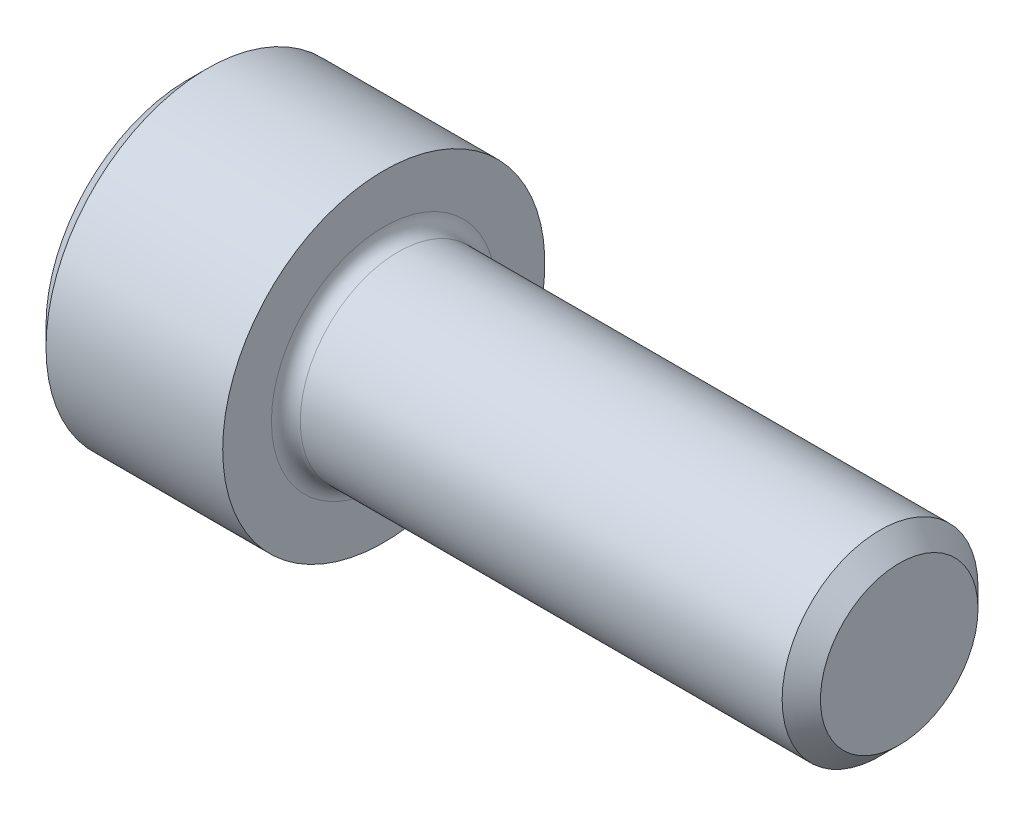
ISO-10303-21;
HEADER;
FILE_DESCRIPTION(('STEP AP214'),'2;1');
FILE_NAME('part.step','',(''),(''),'','','');
FILE_SCHEMA(('AUTOMOTIVE_DESIGN { 1 0 10303 214 1 1 1 1 }'));
ENDSEC;
DATA;
#1=APPLICATION_CONTEXT('core data for automotive mechanical design processes');
#2=APPLICATION_PROTOCOL_DEFINITION('international standard','automotive_design',2000,#1);
#3=PRODUCT_CONTEXT('',#1,'mechanical');
#4=PRODUCT('Part','Part','',(#3));
#5=PRODUCT_RELATED_PRODUCT_CATEGORY('part','',(#4));
#6=PRODUCT_DEFINITION_FORMATION('','',#4);
#7=PRODUCT_DEFINITION_CONTEXT('part definition',#1,'design');
#8=PRODUCT_DEFINITION('design','',#6,#7);
#9=PRODUCT_DEFINITION_SHAPE('','',#8);
#10=(LENGTH_UNIT() NAMED_UNIT(*) SI_UNIT(.MILLI.,.METRE.));
#11=(NAMED_UNIT(*) PLANE_ANGLE_UNIT() SI_UNIT($,.RADIAN.));
#12=(NAMED_UNIT(*) SI_UNIT($,.STERADIAN.) SOLID_ANGLE_UNIT());
#13=UNCERTAINTY_MEASURE_WITH_UNIT(LENGTH_MEASURE(1.E-05),#10,'distance_accuracy_value','');
#14=(GEOMETRIC_REPRESENTATION_CONTEXT(3) GLOBAL_UNCERTAINTY_ASSIGNED_CONTEXT((#13)) GLOBAL_UNIT_ASSIGNED_CONTEXT((#10,
#11,#12)) REPRESENTATION_CONTEXT('',''));
#15=CARTESIAN_POINT('',(0.,0.,0.));
#16=DIRECTION('',(0.,0.,1.));
#17=DIRECTION('',(1.,0.,0.));
#18=AXIS2_PLACEMENT_3D('',#15,#16,#17);
#19=CARTESIAN_POINT('',(2.286,0.,0.));
#20=DIRECTION('',(-1.,0.,0.));
#21=DIRECTION('',(0.,0.,1.));
#22=AXIS2_PLACEMENT_3D('',#19,#20,#21);
#23=PLANE('',#22);
#24=DIRECTION('',(0.,-1.,0.));
#25=VECTOR('',#24,1.);
#26=CARTESIAN_POINT('',(2.286,1.1460460578441,-1.98501));
#27=LINE('',#26,#25);
#28=CARTESIAN_POINT('',(2.286,1.1460460578441,-1.98501));
#29=VERTEX_POINT('',#28);
#30=CARTESIAN_POINT('',(2.286,0.,-1.98501));
#31=VERTEX_POINT('',#30);
#32=EDGE_CURVE('E212',#29,#31,#27,.T.);
#33=ORIENTED_EDGE('',*,*,#32,.T.);
#34=CARTESIAN_POINT('',(2.286,0.,0.));
#35=DIRECTION('',(1.,0.,0.));
#36=DIRECTION('',(0.,0.,-1.));
#37=AXIS2_PLACEMENT_3D('',#34,#35,#36);
#38=CIRCLE('',#37,1.98501);
#39=CARTESIAN_POINT('',(2.286,1.71906908676615,-0.992505000000008));
#40=VERTEX_POINT('',#39);
#41=EDGE_CURVE('E52',#31,#40,#38,.T.);
#42=ORIENTED_EDGE('',*,*,#41,.T.);
#43=DIRECTION('',(0.,-0.500000000000003,-0.866025403784437));
#44=VECTOR('',#43,1.);
#45=CARTESIAN_POINT('',(2.286,2.29209211568821,0.));
#46=LINE('',#45,#44);
#47=EDGE_CURVE('E243',#40,#29,#46,.T.);
#48=ORIENTED_EDGE('',*,*,#47,.T.);
#49=EDGE_LOOP('',(#33,#42,#48));
#50=FACE_BOUND('',#49,.T.);
#51=ADVANCED_FACE('F37',(#50),#23,.T.);
#52=CARTESIAN_POINT('',(2.286,2.29209211568821,0.));
#53=VERTEX_POINT('',#52);
#54=EDGE_CURVE('E240',#53,#40,#46,.T.);
#55=ORIENTED_EDGE('',*,*,#54,.T.);
#56=CARTESIAN_POINT('',(2.286,1.71906908676615,0.992505));
#57=VERTEX_POINT('',#56);
#58=EDGE_CURVE('E203',#40,#57,#38,.T.);
#59=ORIENTED_EDGE('',*,*,#58,.T.);
#60=DIRECTION('',(0.,0.499999999999999,-0.866025403784439));
#61=VECTOR('',#60,1.);
#62=CARTESIAN_POINT('',(2.286,1.14604605784411,1.98501));
#63=LINE('',#62,#61);
#64=EDGE_CURVE('E247',#57,#53,#63,.T.);
#65=ORIENTED_EDGE('',*,*,#64,.T.);
#66=EDGE_LOOP('',(#55,#59,#65));
#67=FACE_BOUND('',#66,.T.);
#68=ADVANCED_FACE('F127',(#67),#23,.T.);
#69=CARTESIAN_POINT('',(2.286,1.14604605784411,1.98501));
#70=VERTEX_POINT('',#69);
#71=EDGE_CURVE('E244',#70,#57,#63,.T.);
#72=ORIENTED_EDGE('',*,*,#71,.T.);
#73=CARTESIAN_POINT('',(2.286,0.,1.98501));
#74=VERTEX_POINT('',#73);
#75=EDGE_CURVE('E261',#57,#74,#38,.T.);
#76=ORIENTED_EDGE('',*,*,#75,.T.);
#77=DIRECTION('',(0.,1.,0.));
#78=VECTOR('',#77,1.);
#79=CARTESIAN_POINT('',(2.286,-1.14604605784409,1.98501));
#80=LINE('',#79,#78);
#81=EDGE_CURVE('E251',#74,#70,#80,.T.);
#82=ORIENTED_EDGE('',*,*,#81,.T.);
#83=EDGE_LOOP('',(#72,#76,#82));
#84=FACE_BOUND('',#83,.T.);
#85=ADVANCED_FACE('F132',(#84),#23,.T.);
#86=CARTESIAN_POINT('',(2.286,-1.14604605784409,1.98501));
#87=VERTEX_POINT('',#86);
#88=EDGE_CURVE('E248',#87,#74,#80,.T.);
#89=ORIENTED_EDGE('',*,*,#88,.T.);
#90=CARTESIAN_POINT('',(2.286,-1.71906908676615,0.992505000000006));
#91=VERTEX_POINT('',#90);
#92=EDGE_CURVE('E265',#74,#91,#38,.T.);
#93=ORIENTED_EDGE('',*,*,#92,.T.);
#94=DIRECTION('',(0.,0.500000000000002,0.866025403784438));
#95=VECTOR('',#94,1.);
#96=CARTESIAN_POINT('',(2.286,-2.2920921156882,0.));
#97=LINE('',#96,#95);
#98=EDGE_CURVE('E255',#91,#87,#97,.T.);
#99=ORIENTED_EDGE('',*,*,#98,.T.);
#100=EDGE_LOOP('',(#89,#93,#99));
#101=FACE_BOUND('',#100,.T.);
#102=ADVANCED_FACE('F277',(#101),#23,.T.);
#103=CARTESIAN_POINT('',(2.286,-2.2920921156882,0.));
#104=VERTEX_POINT('',#103);
#105=EDGE_CURVE('E252',#104,#91,#97,.T.);
#106=ORIENTED_EDGE('',*,*,#105,.T.);
#107=CARTESIAN_POINT('',(2.286,-1.71906908676615,-0.992505000000001));
#108=VERTEX_POINT('',#107);
#109=EDGE_CURVE('E262',#91,#108,#38,.T.);
#110=ORIENTED_EDGE('',*,*,#109,.T.);
#111=DIRECTION('',(0.,-0.5,0.866025403784439));
#112=VECTOR('',#111,1.);
#113=CARTESIAN_POINT('',(2.286,-1.1460460578441,-1.98501));
#114=LINE('',#113,#112);
#115=EDGE_CURVE('E224',#108,#104,#114,.T.);
#116=ORIENTED_EDGE('',*,*,#115,.T.);
#117=EDGE_LOOP('',(#106,#110,#116));
#118=FACE_BOUND('',#117,.T.);
#119=ADVANCED_FACE('F125',(#118),#23,.T.);
#120=CARTESIAN_POINT('',(4.826,0.,0.));
#121=DIRECTION('',(-1.,0.,0.));
#122=DIRECTION('',(0.,0.,1.));
#123=AXIS2_PLACEMENT_3D('',#120,#121,#122);
#124=CYLINDRICAL_SURFACE('',#123,3.96875);
#125=CARTESIAN_POINT('',(0.472439999999965,0.,0.));
#126=DIRECTION('',(-1.,0.,0.));
#127=DIRECTION('',(0.,0.,1.));
#128=AXIS2_PLACEMENT_3D('',#125,#126,#127);
#129=CIRCLE('',#128,3.96875);
#130=CARTESIAN_POINT('',(0.472439999999965,0.,3.96875));
#131=VERTEX_POINT('',#130);
#132=EDGE_CURVE('E190',#131,#131,#129,.F.);
#133=ORIENTED_EDGE('',*,*,#132,.T.);
#134=EDGE_LOOP('',(#133));
#135=FACE_BOUND('',#134,.T.);
#136=CARTESIAN_POINT('',(4.826,0.,0.));
#137=DIRECTION('',(-1.,0.,0.));
#138=DIRECTION('',(0.,0.,1.));
#139=AXIS2_PLACEMENT_3D('',#136,#137,#138);
#140=CIRCLE('',#139,3.96875);
#141=CARTESIAN_POINT('',(4.826,0.,3.96875));
#142=VERTEX_POINT('',#141);
#143=EDGE_CURVE('E204',#142,#142,#140,.T.);
#144=ORIENTED_EDGE('',*,*,#143,.T.);
#145=EDGE_LOOP('',(#144));
#146=FACE_BOUND('',#145,.T.);
#147=ADVANCED_FACE('F173',(#135,#146),#124,.T.);
#148=CARTESIAN_POINT('',(4.826,3.96875,0.));
#149=DIRECTION('',(1.,0.,0.));
#150=DIRECTION('',(0.,0.,-1.));
#151=AXIS2_PLACEMENT_3D('',#148,#149,#150);
#152=PLANE('',#151);
#153=CARTESIAN_POINT('',(4.826,0.,0.));
#154=DIRECTION('',(1.,0.,0.));
#155=DIRECTION('',(0.,0.,-1.));
#156=AXIS2_PLACEMENT_3D('',#153,#154,#155);
#157=CIRCLE('',#156,2.7686);
#158=CARTESIAN_POINT('',(4.826,0.,-2.7686));
#159=VERTEX_POINT('',#158);
#160=EDGE_CURVE('E11',#159,#159,#157,.F.);
#161=ORIENTED_EDGE('',*,*,#160,.T.);
#162=EDGE_LOOP('',(#161));
#163=FACE_BOUND('',#162,.T.);
#164=ORIENTED_EDGE('',*,*,#143,.F.);
#165=EDGE_LOOP('',(#164));
#166=FACE_BOUND('',#165,.T.);
#167=ADVANCED_FACE('F169',(#163,#166),#152,.T.);
#168=CARTESIAN_POINT('',(0.,0.,0.));
#169=DIRECTION('',(-1.,0.,0.));
#170=DIRECTION('',(0.,0.,1.));
#171=AXIS2_PLACEMENT_3D('',#168,#169,#170);
#172=PLANE('',#171);
#173=CARTESIAN_POINT('',(0.,0.,0.));
#174=DIRECTION('',(-1.,0.,0.));
#175=DIRECTION('',(0.,0.,1.));
#176=AXIS2_PLACEMENT_3D('',#173,#174,#175);
#177=CIRCLE('',#176,3.49631);
#178=CARTESIAN_POINT('',(0.,0.,3.49631));
#179=VERTEX_POINT('',#178);
#180=EDGE_CURVE('E194',#179,#179,#177,.T.);
#181=ORIENTED_EDGE('',*,*,#180,.T.);
#182=EDGE_LOOP('',(#181));
#183=FACE_BOUND('',#182,.T.);
#184=DIRECTION('',(0.,-0.5,0.866025403784439));
#185=VECTOR('',#184,1.);
#186=CARTESIAN_POINT('',(0.,-1.1460460578441,-1.98501));
#187=LINE('',#186,#185);
#188=CARTESIAN_POINT('',(0.,-1.1460460578441,-1.98501));
#189=VERTEX_POINT('',#188);
#190=CARTESIAN_POINT('',(0.,-2.29209211568819,0.));
#191=VERTEX_POINT('',#190);
#192=EDGE_CURVE('E60',#189,#191,#187,.T.);
#193=ORIENTED_EDGE('',*,*,#192,.F.);
#194=DIRECTION('',(0.,-1.,0.));
#195=VECTOR('',#194,1.);
#196=CARTESIAN_POINT('',(0.,1.1460460578441,-1.98501));
#197=LINE('',#196,#195);
#198=CARTESIAN_POINT('',(0.,1.1460460578441,-1.98501));
#199=VERTEX_POINT('',#198);
#200=EDGE_CURVE('E221',#199,#189,#197,.T.);
#201=ORIENTED_EDGE('',*,*,#200,.F.);
#202=DIRECTION('',(0.,-0.500000000000003,-0.866025403784437));
#203=VECTOR('',#202,1.);
#204=CARTESIAN_POINT('',(0.,2.29209211568821,0.));
#205=LINE('',#204,#203);
#206=CARTESIAN_POINT('',(0.,2.29209211568821,0.));
#207=VERTEX_POINT('',#206);
#208=EDGE_CURVE('E225',#207,#199,#205,.T.);
#209=ORIENTED_EDGE('',*,*,#208,.F.);
#210=DIRECTION('',(0.,0.499999999999999,-0.866025403784439));
#211=VECTOR('',#210,1.);
#212=CARTESIAN_POINT('',(0.,1.14604605784411,1.98501));
#213=LINE('',#212,#211);
#214=CARTESIAN_POINT('',(0.,1.14604605784411,1.98501));
#215=VERTEX_POINT('',#214);
#216=EDGE_CURVE('E228',#215,#207,#213,.T.);
#217=ORIENTED_EDGE('',*,*,#216,.F.);
#218=DIRECTION('',(0.,1.,0.));
#219=VECTOR('',#218,1.);
#220=CARTESIAN_POINT('',(0.,-1.14604605784409,1.98501));
#221=LINE('',#220,#219);
#222=CARTESIAN_POINT('',(0.,-1.14604605784409,1.98501));
#223=VERTEX_POINT('',#222);
#224=EDGE_CURVE('E231',#223,#215,#221,.T.);
#225=ORIENTED_EDGE('',*,*,#224,.F.);
#226=DIRECTION('',(0.,0.500000000000002,0.866025403784438));
#227=VECTOR('',#226,1.);
#228=CARTESIAN_POINT('',(0.,-2.2920921156882,0.));
#229=LINE('',#228,#227);
#230=EDGE_CURVE('E234',#191,#223,#229,.T.);
#231=ORIENTED_EDGE('',*,*,#230,.F.);
#232=EDGE_LOOP('',(#193,#201,#209,#217,#225,#231));
#233=FACE_BOUND('',#232,.T.);
#234=ADVANCED_FACE('F165',(#183,#233),#172,.T.);
#235=CARTESIAN_POINT('',(17.526,0.,0.));
#236=DIRECTION('',(-1.,0.,0.));
#237=DIRECTION('',(0.,0.,1.));
#238=AXIS2_PLACEMENT_3D('',#235,#236,#237);
#239=CYLINDRICAL_SURFACE('',#238,2.413);
#240=CARTESIAN_POINT('',(5.1816,0.,0.));
#241=DIRECTION('',(1.,0.,0.));
#242=DIRECTION('',(0.,0.,-1.));
#243=AXIS2_PLACEMENT_3D('',#240,#241,#242);
#244=CIRCLE('',#243,2.413);
#245=CARTESIAN_POINT('',(5.1816,0.,-2.413));
#246=VERTEX_POINT('',#245);
#247=EDGE_CURVE('E45',#246,#246,#244,.T.);
#248=ORIENTED_EDGE('',*,*,#247,.T.);
#249=EDGE_LOOP('',(#248));
#250=FACE_BOUND('',#249,.T.);
#251=CARTESIAN_POINT('',(17.05356,0.,0.));
#252=DIRECTION('',(1.,0.,0.));
#253=DIRECTION('',(0.,0.,-1.));
#254=AXIS2_PLACEMENT_3D('',#251,#252,#253);
#255=CIRCLE('',#254,2.413);
#256=CARTESIAN_POINT('',(17.05356,0.,-2.413));
#257=VERTEX_POINT('',#256);
#258=EDGE_CURVE('E186',#257,#257,#255,.F.);
#259=ORIENTED_EDGE('',*,*,#258,.T.);
#260=EDGE_LOOP('',(#259));
#261=FACE_BOUND('',#260,.T.);
#262=ADVANCED_FACE('F161',(#250,#261),#239,.T.);
#263=CARTESIAN_POINT('',(17.526,0.,0.));
#264=DIRECTION('',(1.,0.,0.));
#265=DIRECTION('',(0.,0.,-1.));
#266=AXIS2_PLACEMENT_3D('',#263,#264,#265);
#267=PLANE('',#266);
#268=CARTESIAN_POINT('',(17.526,0.,0.));
#269=DIRECTION('',(1.,0.,0.));
#270=DIRECTION('',(0.,0.,-1.));
#271=AXIS2_PLACEMENT_3D('',#268,#269,#270);
#272=CIRCLE('',#271,1.94055999999999);
#273=CARTESIAN_POINT('',(17.526,0.,-1.94055999999999));
#274=VERTEX_POINT('',#273);
#275=EDGE_CURVE('E189',#274,#274,#272,.T.);
#276=ORIENTED_EDGE('',*,*,#275,.T.);
#277=EDGE_LOOP('',(#276));
#278=FACE_BOUND('',#277,.T.);
#279=ADVANCED_FACE('F158',(#278),#267,.T.);
#280=CARTESIAN_POINT('',(2.286,-1.1460460578441,-1.98501));
#281=DIRECTION('',(0.,-0.866025403784439,-0.5));
#282=DIRECTION('',(0.,0.5,-0.866025403784439));
#283=AXIS2_PLACEMENT_3D('',#280,#281,#282);
#284=PLANE('',#283);
#285=ORIENTED_EDGE('',*,*,#192,.T.);
#286=DIRECTION('',(-1.,0.,0.));
#287=VECTOR('',#286,1.);
#288=CARTESIAN_POINT('',(2.286,-2.2920921156882,0.));
#289=LINE('',#288,#287);
#290=EDGE_CURVE('E209',#104,#191,#289,.T.);
#291=ORIENTED_EDGE('',*,*,#290,.F.);
#292=ORIENTED_EDGE('',*,*,#115,.F.);
#293=CARTESIAN_POINT('',(2.286,-1.1460460578441,-1.98501));
#294=VERTEX_POINT('',#293);
#295=EDGE_CURVE('E256',#294,#108,#114,.T.);
#296=ORIENTED_EDGE('',*,*,#295,.F.);
#297=DIRECTION('',(-1.,0.,0.));
#298=VECTOR('',#297,1.);
#299=CARTESIAN_POINT('',(2.286,-1.1460460578441,-1.98501));
#300=LINE('',#299,#298);
#301=EDGE_CURVE('E208',#294,#189,#300,.T.);
#302=ORIENTED_EDGE('',*,*,#301,.T.);
#303=EDGE_LOOP('',(#285,#291,#292,#296,#302));
#304=FACE_BOUND('',#303,.T.);
#305=ADVANCED_FACE('F140',(#304),#284,.F.);
#306=CARTESIAN_POINT('',(2.286,1.1460460578441,-1.98501));
#307=DIRECTION('',(0.,0.,-1.));
#308=DIRECTION('',(-1.,0.,0.));
#309=AXIS2_PLACEMENT_3D('',#306,#307,#308);
#310=PLANE('',#309);
#311=ORIENTED_EDGE('',*,*,#200,.T.);
#312=ORIENTED_EDGE('',*,*,#301,.F.);
#313=EDGE_CURVE('E239',#31,#294,#27,.T.);
#314=ORIENTED_EDGE('',*,*,#313,.F.);
#315=ORIENTED_EDGE('',*,*,#32,.F.);
#316=DIRECTION('',(-1.,0.,0.));
#317=VECTOR('',#316,1.);
#318=CARTESIAN_POINT('',(2.286,1.1460460578441,-1.98501));
#319=LINE('',#318,#317);
#320=EDGE_CURVE('E218',#29,#199,#319,.T.);
#321=ORIENTED_EDGE('',*,*,#320,.T.);
#322=EDGE_LOOP('',(#311,#312,#314,#315,#321));
#323=FACE_BOUND('',#322,.T.);
#324=ADVANCED_FACE('F136',(#323),#310,.F.);
#325=CARTESIAN_POINT('',(2.286,2.29209211568821,0.));
#326=DIRECTION('',(0.,0.866025403784437,-0.500000000000003));
#327=DIRECTION('',(0.,0.500000000000003,0.866025403784437));
#328=AXIS2_PLACEMENT_3D('',#325,#326,#327);
#329=PLANE('',#328);
#330=ORIENTED_EDGE('',*,*,#208,.T.);
#331=ORIENTED_EDGE('',*,*,#320,.F.);
#332=ORIENTED_EDGE('',*,*,#47,.F.);
#333=ORIENTED_EDGE('',*,*,#54,.F.);
#334=DIRECTION('',(-1.,0.,0.));
#335=VECTOR('',#334,1.);
#336=CARTESIAN_POINT('',(2.286,2.29209211568821,0.));
#337=LINE('',#336,#335);
#338=EDGE_CURVE('E216',#53,#207,#337,.T.);
#339=ORIENTED_EDGE('',*,*,#338,.T.);
#340=EDGE_LOOP('',(#330,#331,#332,#333,#339));
#341=FACE_BOUND('',#340,.T.);
#342=ADVANCED_FACE('F139',(#341),#329,.F.);
#343=CARTESIAN_POINT('',(2.286,1.14604605784411,1.98501));
#344=DIRECTION('',(0.,0.866025403784439,0.499999999999999));
#345=DIRECTION('',(0.,-0.499999999999999,0.866025403784439));
#346=AXIS2_PLACEMENT_3D('',#343,#344,#345);
#347=PLANE('',#346);
#348=ORIENTED_EDGE('',*,*,#216,.T.);
#349=ORIENTED_EDGE('',*,*,#338,.F.);
#350=ORIENTED_EDGE('',*,*,#64,.F.);
#351=ORIENTED_EDGE('',*,*,#71,.F.);
#352=DIRECTION('',(-1.,0.,0.));
#353=VECTOR('',#352,1.);
#354=CARTESIAN_POINT('',(2.286,1.14604605784411,1.98501));
#355=LINE('',#354,#353);
#356=EDGE_CURVE('E214',#70,#215,#355,.T.);
#357=ORIENTED_EDGE('',*,*,#356,.T.);
#358=EDGE_LOOP('',(#348,#349,#350,#351,#357));
#359=FACE_BOUND('',#358,.T.);
#360=ADVANCED_FACE('F144',(#359),#347,.F.);
#361=CARTESIAN_POINT('',(2.286,-1.14604605784409,1.98501));
#362=DIRECTION('',(0.,0.,1.));
#363=DIRECTION('',(1.,0.,0.));
#364=AXIS2_PLACEMENT_3D('',#361,#362,#363);
#365=PLANE('',#364);
#366=ORIENTED_EDGE('',*,*,#224,.T.);
#367=ORIENTED_EDGE('',*,*,#356,.F.);
#368=ORIENTED_EDGE('',*,*,#81,.F.);
#369=ORIENTED_EDGE('',*,*,#88,.F.);
#370=DIRECTION('',(-1.,0.,0.));
#371=VECTOR('',#370,1.);
#372=CARTESIAN_POINT('',(2.286,-1.14604605784409,1.98501));
#373=LINE('',#372,#371);
#374=EDGE_CURVE('E211',#87,#223,#373,.T.);
#375=ORIENTED_EDGE('',*,*,#374,.T.);
#376=EDGE_LOOP('',(#366,#367,#368,#369,#375));
#377=FACE_BOUND('',#376,.T.);
#378=ADVANCED_FACE('F148',(#377),#365,.F.);
#379=CARTESIAN_POINT('',(2.286,-2.2920921156882,0.));
#380=DIRECTION('',(0.,-0.866025403784438,0.500000000000002));
#381=DIRECTION('',(0.,-0.500000000000002,-0.866025403784438));
#382=AXIS2_PLACEMENT_3D('',#379,#380,#381);
#383=PLANE('',#382);
#384=ORIENTED_EDGE('',*,*,#230,.T.);
#385=ORIENTED_EDGE('',*,*,#374,.F.);
#386=ORIENTED_EDGE('',*,*,#98,.F.);
#387=ORIENTED_EDGE('',*,*,#105,.F.);
#388=ORIENTED_EDGE('',*,*,#290,.T.);
#389=EDGE_LOOP('',(#384,#385,#386,#387,#388));
#390=FACE_BOUND('',#389,.T.);
#391=ADVANCED_FACE('F122',(#390),#383,.F.);
#392=ORIENTED_EDGE('',*,*,#295,.T.);
#393=EDGE_CURVE('E207',#108,#31,#38,.T.);
#394=ORIENTED_EDGE('',*,*,#393,.T.);
#395=ORIENTED_EDGE('',*,*,#313,.T.);
#396=EDGE_LOOP('',(#392,#394,#395));
#397=FACE_BOUND('',#396,.T.);
#398=ADVANCED_FACE('F113',(#397),#23,.T.);
#399=CARTESIAN_POINT('',(3.4320460578441,0.,0.));
#400=DIRECTION('',(-1.,0.,0.));
#401=DIRECTION('',(0.,0.,1.));
#402=AXIS2_PLACEMENT_3D('',#399,#400,#401);
#403=CONICAL_SURFACE('',#402,0.,1.0471975511966);
#404=ORIENTED_EDGE('',*,*,#41,.F.);
#405=ORIENTED_EDGE('',*,*,#393,.F.);
#406=ORIENTED_EDGE('',*,*,#109,.F.);
#407=ORIENTED_EDGE('',*,*,#92,.F.);
#408=ORIENTED_EDGE('',*,*,#75,.F.);
#409=ORIENTED_EDGE('',*,*,#58,.F.);
#410=EDGE_LOOP('',(#404,#405,#406,#407,#408,#409));
#411=FACE_BOUND('',#410,.T.);
#412=CARTESIAN_POINT('',(3.4320460578441,0.,0.));
#413=VERTEX_POINT('',#412);
#414=VERTEX_LOOP('',#413);
#415=FACE_BOUND('',#414,.T.);
#416=ADVANCED_FACE('F110',(#411,#415),#403,.F.);
#417=CARTESIAN_POINT('',(0.,0.,0.));
#418=DIRECTION('',(1.,0.,0.));
#419=DIRECTION('',(0.,0.,-1.));
#420=AXIS2_PLACEMENT_3D('',#417,#418,#419);
#421=CONICAL_SURFACE('',#420,3.49631,0.785398163397491);
#422=ORIENTED_EDGE('',*,*,#132,.F.);
#423=EDGE_LOOP('',(#422));
#424=FACE_BOUND('',#423,.T.);
#425=ORIENTED_EDGE('',*,*,#180,.F.);
#426=EDGE_LOOP('',(#425));
#427=FACE_BOUND('',#426,.T.);
#428=ADVANCED_FACE('F112',(#424,#427),#421,.T.);
#429=CARTESIAN_POINT('',(17.526,0.,0.));
#430=DIRECTION('',(-1.,0.,0.));
#431=DIRECTION('',(0.,0.,1.));
#432=AXIS2_PLACEMENT_3D('',#429,#430,#431);
#433=CONICAL_SURFACE('',#432,1.94055999999999,0.785398163397494);
#434=ORIENTED_EDGE('',*,*,#258,.F.);
#435=EDGE_LOOP('',(#434));
#436=FACE_BOUND('',#435,.T.);
#437=ORIENTED_EDGE('',*,*,#275,.F.);
#438=EDGE_LOOP('',(#437));
#439=FACE_BOUND('',#438,.T.);
#440=ADVANCED_FACE('F119',(#436,#439),#433,.T.);
#441=CARTESIAN_POINT('',(5.1816,0.,0.));
#442=DIRECTION('',(1.,0.,0.));
#443=DIRECTION('',(0.,0.,-1.));
#444=AXIS2_PLACEMENT_3D('',#441,#442,#443);
#445=TOROIDAL_SURFACE('',#444,2.7686,0.3556);
#446=ORIENTED_EDGE('',*,*,#160,.F.);
#447=EDGE_LOOP('',(#446));
#448=FACE_BOUND('',#447,.T.);
#449=ORIENTED_EDGE('',*,*,#247,.F.);
#450=EDGE_LOOP('',(#449));
#451=FACE_BOUND('',#450,.T.);
#452=ADVANCED_FACE('F39',(#448,#451),#445,.F.);
#453=CLOSED_SHELL('',(#51,#68,#85,#102,#119,#147,#167,#234,#262,#279,#305,#324,#342,#360,#378,
#391,#398,#416,#428,#440,#452));
#454=MANIFOLD_SOLID_BREP('B2',#453);
#455=ADVANCED_BREP_SHAPE_REPRESENTATION('',(#18,#454),#14);
#456=SHAPE_DEFINITION_REPRESENTATION(#9,#455);
ENDSEC;
END-ISO-10303-21;
